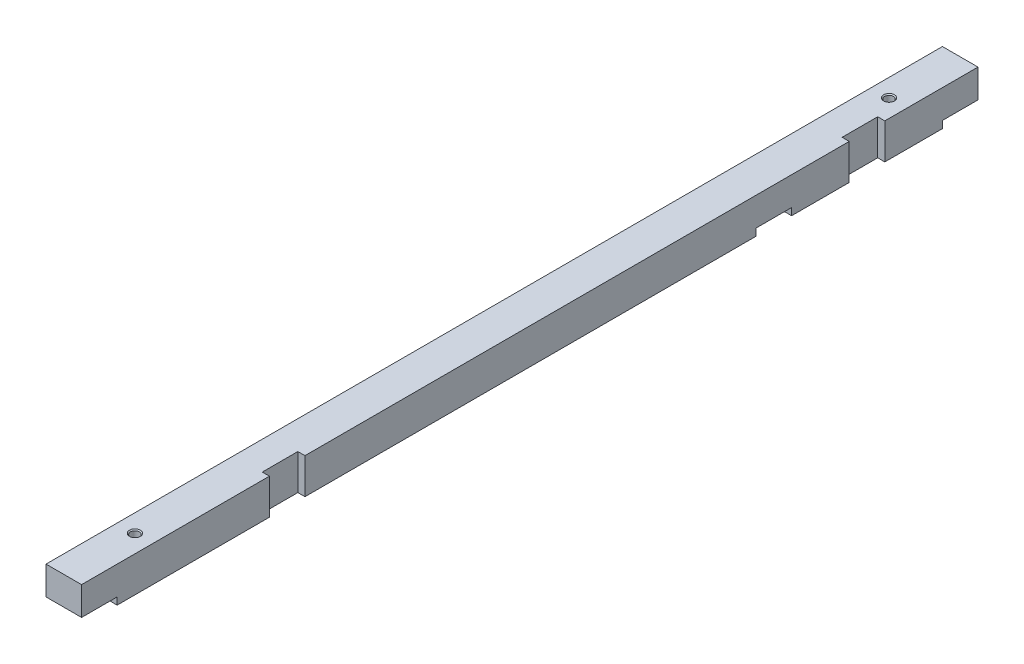
ISO-10303-21;
HEADER;
FILE_DESCRIPTION(('STEP AP214'),'2;1');
FILE_NAME('part.step','',(''),(''),'','','');
FILE_SCHEMA(('AUTOMOTIVE_DESIGN { 1 0 10303 214 1 1 1 1 }'));
ENDSEC;
DATA;
#1=APPLICATION_CONTEXT('core data for automotive mechanical design processes');
#2=APPLICATION_PROTOCOL_DEFINITION('international standard','automotive_design',2000,#1);
#3=PRODUCT_CONTEXT('',#1,'mechanical');
#4=PRODUCT('Part','Part','',(#3));
#5=PRODUCT_RELATED_PRODUCT_CATEGORY('part','',(#4));
#6=PRODUCT_DEFINITION_FORMATION('','',#4);
#7=PRODUCT_DEFINITION_CONTEXT('part definition',#1,'design');
#8=PRODUCT_DEFINITION('design','',#6,#7);
#9=PRODUCT_DEFINITION_SHAPE('','',#8);
#10=(LENGTH_UNIT() NAMED_UNIT(*) SI_UNIT(.MILLI.,.METRE.));
#11=(NAMED_UNIT(*) PLANE_ANGLE_UNIT() SI_UNIT($,.RADIAN.));
#12=(NAMED_UNIT(*) SI_UNIT($,.STERADIAN.) SOLID_ANGLE_UNIT());
#13=UNCERTAINTY_MEASURE_WITH_UNIT(LENGTH_MEASURE(1.E-05),#10,'distance_accuracy_value','');
#14=(GEOMETRIC_REPRESENTATION_CONTEXT(3) GLOBAL_UNCERTAINTY_ASSIGNED_CONTEXT((#13)) GLOBAL_UNIT_ASSIGNED_CONTEXT((#10,
#11,#12)) REPRESENTATION_CONTEXT('',''));
#15=CARTESIAN_POINT('',(0.,0.,0.));
#16=DIRECTION('',(0.,0.,1.));
#17=DIRECTION('',(1.,0.,0.));
#18=AXIS2_PLACEMENT_3D('',#15,#16,#17);
#19=CARTESIAN_POINT('',(5.,5.,252.));
#20=DIRECTION('',(-1.,0.,0.));
#21=DIRECTION('',(0.,-1.,0.));
#22=AXIS2_PLACEMENT_3D('',#19,#20,#21);
#23=PLANE('',#22);
#24=DIRECTION('',(0.,0.,-1.));
#25=VECTOR('',#24,1.);
#26=CARTESIAN_POINT('',(5.,5.,252.));
#27=LINE('',#26,#25);
#28=CARTESIAN_POINT('',(5.,5.,189.2));
#29=VERTEX_POINT('',#28);
#30=CARTESIAN_POINT('',(5.,5.,36.2));
#31=VERTEX_POINT('',#30);
#32=EDGE_CURVE('E316',#29,#31,#27,.T.);
#33=ORIENTED_EDGE('',*,*,#32,.F.);
#34=DIRECTION('',(0.,-1.,0.));
#35=VECTOR('',#34,1.);
#36=CARTESIAN_POINT('',(5.,5.,189.2));
#37=LINE('',#36,#35);
#38=CARTESIAN_POINT('',(5.,-5.00000000000002,189.2));
#39=VERTEX_POINT('',#38);
#40=EDGE_CURVE('E206',#29,#39,#37,.T.);
#41=ORIENTED_EDGE('',*,*,#40,.T.);
#42=DIRECTION('',(0.,0.,-1.));
#43=VECTOR('',#42,1.);
#44=CARTESIAN_POINT('',(5.,-5.,252.));
#45=LINE('',#44,#43);
#46=CARTESIAN_POINT('',(5.,-5.,62.4));
#47=VERTEX_POINT('',#46);
#48=EDGE_CURVE('E191',#39,#47,#45,.T.);
#49=ORIENTED_EDGE('',*,*,#48,.T.);
#50=DIRECTION('',(0.,1.,0.));
#51=VECTOR('',#50,1.);
#52=CARTESIAN_POINT('',(5.,-5.,62.4));
#53=LINE('',#52,#51);
#54=CARTESIAN_POINT('',(5.,-3.,62.4));
#55=VERTEX_POINT('',#54);
#56=EDGE_CURVE('E251',#47,#55,#53,.T.);
#57=ORIENTED_EDGE('',*,*,#56,.T.);
#58=DIRECTION('',(0.,0.,-1.));
#59=VECTOR('',#58,1.);
#60=CARTESIAN_POINT('',(5.,-3.,52.3999999999999));
#61=LINE('',#60,#59);
#62=CARTESIAN_POINT('',(5.,-3.,52.3999999999999));
#63=VERTEX_POINT('',#62);
#64=EDGE_CURVE('E255',#55,#63,#61,.T.);
#65=ORIENTED_EDGE('',*,*,#64,.T.);
#66=DIRECTION('',(0.,-1.,0.));
#67=VECTOR('',#66,1.);
#68=CARTESIAN_POINT('',(5.,-5.,52.3999999999999));
#69=LINE('',#68,#67);
#70=CARTESIAN_POINT('',(5.,-5.,52.3999999999999));
#71=VERTEX_POINT('',#70);
#72=EDGE_CURVE('E248',#63,#71,#69,.T.);
#73=ORIENTED_EDGE('',*,*,#72,.T.);
#74=CARTESIAN_POINT('',(5.,-5.,36.2));
#75=VERTEX_POINT('',#74);
#76=EDGE_CURVE('E321',#71,#75,#45,.T.);
#77=ORIENTED_EDGE('',*,*,#76,.T.);
#78=DIRECTION('',(0.,1.,0.));
#79=VECTOR('',#78,1.);
#80=CARTESIAN_POINT('',(5.,5.,36.2));
#81=LINE('',#80,#79);
#82=EDGE_CURVE('E222',#75,#31,#81,.T.);
#83=ORIENTED_EDGE('',*,*,#82,.T.);
#84=EDGE_LOOP('',(#33,#41,#49,#57,#65,#73,#77,#83));
#85=FACE_BOUND('',#84,.T.);
#86=ADVANCED_FACE('F36',(#85),#23,.F.);
#87=CARTESIAN_POINT('',(5.,5.,26.2));
#88=VERTEX_POINT('',#87);
#89=CARTESIAN_POINT('',(5.,5.,0.));
#90=VERTEX_POINT('',#89);
#91=EDGE_CURVE('E311',#88,#90,#27,.T.);
#92=ORIENTED_EDGE('',*,*,#91,.F.);
#93=DIRECTION('',(0.,-1.,0.));
#94=VECTOR('',#93,1.);
#95=CARTESIAN_POINT('',(5.,5.,26.2));
#96=LINE('',#95,#94);
#97=CARTESIAN_POINT('',(5.,-5.,26.2));
#98=VERTEX_POINT('',#97);
#99=EDGE_CURVE('E226',#88,#98,#96,.T.);
#100=ORIENTED_EDGE('',*,*,#99,.T.);
#101=CARTESIAN_POINT('',(5.,-5.,10.));
#102=VERTEX_POINT('',#101);
#103=EDGE_CURVE('E315',#98,#102,#45,.T.);
#104=ORIENTED_EDGE('',*,*,#103,.T.);
#105=DIRECTION('',(0.,1.,0.));
#106=VECTOR('',#105,1.);
#107=CARTESIAN_POINT('',(5.,-5.,10.));
#108=LINE('',#107,#106);
#109=CARTESIAN_POINT('',(5.,-3.,10.));
#110=VERTEX_POINT('',#109);
#111=EDGE_CURVE('E275',#102,#110,#108,.T.);
#112=ORIENTED_EDGE('',*,*,#111,.T.);
#113=DIRECTION('',(0.,0.,-1.));
#114=VECTOR('',#113,1.);
#115=CARTESIAN_POINT('',(5.,-3.,0.));
#116=LINE('',#115,#114);
#117=CARTESIAN_POINT('',(5.,-3.,0.));
#118=VERTEX_POINT('',#117);
#119=EDGE_CURVE('E278',#110,#118,#116,.T.);
#120=ORIENTED_EDGE('',*,*,#119,.T.);
#121=DIRECTION('',(0.,1.,0.));
#122=VECTOR('',#121,1.);
#123=CARTESIAN_POINT('',(5.,5.,0.));
#124=LINE('',#123,#122);
#125=EDGE_CURVE('E305',#118,#90,#124,.T.);
#126=ORIENTED_EDGE('',*,*,#125,.T.);
#127=EDGE_LOOP('',(#92,#100,#104,#112,#120,#126));
#128=FACE_BOUND('',#127,.T.);
#129=ADVANCED_FACE('F340',(#128),#23,.F.);
#130=CARTESIAN_POINT('',(-5.,-5.,252.));
#131=DIRECTION('',(0.,1.,0.));
#132=DIRECTION('',(0.,0.,1.));
#133=AXIS2_PLACEMENT_3D('',#130,#131,#132);
#134=PLANE('',#133);
#135=CARTESIAN_POINT('',(0.,-5.00000000000002,20.));
#136=DIRECTION('',(0.,1.,0.));
#137=DIRECTION('',(0.,0.,1.));
#138=AXIS2_PLACEMENT_3D('',#135,#136,#137);
#139=CIRCLE('',#138,1.25);
#140=CARTESIAN_POINT('',(0.,-5.00000000000002,21.25));
#141=VERTEX_POINT('',#140);
#142=EDGE_CURVE('E601',#141,#141,#139,.T.);
#143=ORIENTED_EDGE('',*,*,#142,.T.);
#144=EDGE_LOOP('',(#143));
#145=FACE_BOUND('',#144,.T.);
#146=ORIENTED_EDGE('',*,*,#103,.F.);
#147=DIRECTION('',(1.,0.,0.));
#148=VECTOR('',#147,1.);
#149=CARTESIAN_POINT('',(3.00000000000003,-5.,26.2));
#150=LINE('',#149,#148);
#151=CARTESIAN_POINT('',(3.00000000000003,-5.,26.2));
#152=VERTEX_POINT('',#151);
#153=EDGE_CURVE('E208',#152,#98,#150,.T.);
#154=ORIENTED_EDGE('',*,*,#153,.F.);
#155=DIRECTION('',(0.,0.,-1.));
#156=VECTOR('',#155,1.);
#157=CARTESIAN_POINT('',(3.00000000000003,-5.,36.2));
#158=LINE('',#157,#156);
#159=CARTESIAN_POINT('',(3.00000000000003,-5.,36.2));
#160=VERTEX_POINT('',#159);
#161=EDGE_CURVE('E212',#160,#152,#158,.T.);
#162=ORIENTED_EDGE('',*,*,#161,.F.);
#163=DIRECTION('',(-1.,0.,0.));
#164=VECTOR('',#163,1.);
#165=CARTESIAN_POINT('',(234.,-5.,36.2));
#166=LINE('',#165,#164);
#167=EDGE_CURVE('E216',#75,#160,#166,.T.);
#168=ORIENTED_EDGE('',*,*,#167,.F.);
#169=ORIENTED_EDGE('',*,*,#76,.F.);
#170=DIRECTION('',(-1.,0.,0.));
#171=VECTOR('',#170,1.);
#172=CARTESIAN_POINT('',(5.,-5.,52.3999999999999));
#173=LINE('',#172,#171);
#174=CARTESIAN_POINT('',(-5.,-5.00000000000001,52.3999999999999));
#175=VERTEX_POINT('',#174);
#176=EDGE_CURVE('E258',#71,#175,#173,.T.);
#177=ORIENTED_EDGE('',*,*,#176,.T.);
#178=DIRECTION('',(0.,0.,-1.));
#179=VECTOR('',#178,1.);
#180=CARTESIAN_POINT('',(-5.,-5.,252.));
#181=LINE('',#180,#179);
#182=CARTESIAN_POINT('',(-5.,-5.00000000000001,10.));
#183=VERTEX_POINT('',#182);
#184=EDGE_CURVE('E320',#175,#183,#181,.T.);
#185=ORIENTED_EDGE('',*,*,#184,.T.);
#186=DIRECTION('',(-1.,0.,0.));
#187=VECTOR('',#186,1.);
#188=CARTESIAN_POINT('',(5.,-5.,10.));
#189=LINE('',#188,#187);
#190=EDGE_CURVE('E282',#102,#183,#189,.T.);
#191=ORIENTED_EDGE('',*,*,#190,.F.);
#192=EDGE_LOOP('',(#146,#154,#162,#168,#169,#177,#185,#191));
#193=FACE_BOUND('',#192,.T.);
#194=ADVANCED_FACE('F347',(#145,#193),#134,.F.);
#195=CARTESIAN_POINT('',(-5.,5.,252.));
#196=DIRECTION('',(1.,0.,0.));
#197=DIRECTION('',(0.,1.,0.));
#198=AXIS2_PLACEMENT_3D('',#195,#196,#197);
#199=PLANE('',#198);
#200=CARTESIAN_POINT('',(-5.,-5.00000000000002,242.));
#201=VERTEX_POINT('',#200);
#202=CARTESIAN_POINT('',(-5.,-5.00000000000001,62.4));
#203=VERTEX_POINT('',#202);
#204=EDGE_CURVE('E322',#201,#203,#181,.T.);
#205=ORIENTED_EDGE('',*,*,#204,.F.);
#206=DIRECTION('',(0.,-1.,0.));
#207=VECTOR('',#206,1.);
#208=CARTESIAN_POINT('',(-5.,-5.00000000000002,242.));
#209=LINE('',#208,#207);
#210=CARTESIAN_POINT('',(-5.,-3.,242.));
#211=VERTEX_POINT('',#210);
#212=EDGE_CURVE('E229',#211,#201,#209,.T.);
#213=ORIENTED_EDGE('',*,*,#212,.F.);
#214=DIRECTION('',(0.,0.,-1.));
#215=VECTOR('',#214,1.);
#216=CARTESIAN_POINT('',(-5.,-3.,242.));
#217=LINE('',#216,#215);
#218=CARTESIAN_POINT('',(-5.,-3.,252.));
#219=VERTEX_POINT('',#218);
#220=EDGE_CURVE('E234',#219,#211,#217,.T.);
#221=ORIENTED_EDGE('',*,*,#220,.F.);
#222=DIRECTION('',(0.,-1.,0.));
#223=VECTOR('',#222,1.);
#224=CARTESIAN_POINT('',(-5.,5.,252.));
#225=LINE('',#224,#223);
#226=CARTESIAN_POINT('',(-5.,5.,252.));
#227=VERTEX_POINT('',#226);
#228=EDGE_CURVE('E294',#227,#219,#225,.T.);
#229=ORIENTED_EDGE('',*,*,#228,.F.);
#230=DIRECTION('',(0.,0.,-1.));
#231=VECTOR('',#230,1.);
#232=CARTESIAN_POINT('',(-5.,5.,252.));
#233=LINE('',#232,#231);
#234=CARTESIAN_POINT('',(-5.,5.,0.));
#235=VERTEX_POINT('',#234);
#236=EDGE_CURVE('E302',#227,#235,#233,.T.);
#237=ORIENTED_EDGE('',*,*,#236,.T.);
#238=DIRECTION('',(0.,-1.,0.));
#239=VECTOR('',#238,1.);
#240=CARTESIAN_POINT('',(-5.,5.,0.));
#241=LINE('',#240,#239);
#242=CARTESIAN_POINT('',(-5.,-3.,0.));
#243=VERTEX_POINT('',#242);
#244=EDGE_CURVE('E289',#235,#243,#241,.T.);
#245=ORIENTED_EDGE('',*,*,#244,.T.);
#246=DIRECTION('',(0.,0.,-1.));
#247=VECTOR('',#246,1.);
#248=CARTESIAN_POINT('',(-5.,-3.,0.));
#249=LINE('',#248,#247);
#250=CARTESIAN_POINT('',(-5.,-3.,10.));
#251=VERTEX_POINT('',#250);
#252=EDGE_CURVE('E279',#251,#243,#249,.T.);
#253=ORIENTED_EDGE('',*,*,#252,.F.);
#254=DIRECTION('',(0.,1.,0.));
#255=VECTOR('',#254,1.);
#256=CARTESIAN_POINT('',(-5.,-5.00000000000001,10.));
#257=LINE('',#256,#255);
#258=EDGE_CURVE('E267',#183,#251,#257,.T.);
#259=ORIENTED_EDGE('',*,*,#258,.F.);
#260=ORIENTED_EDGE('',*,*,#184,.F.);
#261=DIRECTION('',(0.,-1.,0.));
#262=VECTOR('',#261,1.);
#263=CARTESIAN_POINT('',(-5.,-5.00000000000001,52.3999999999999));
#264=LINE('',#263,#262);
#265=CARTESIAN_POINT('',(-5.,-3.,52.3999999999999));
#266=VERTEX_POINT('',#265);
#267=EDGE_CURVE('E243',#266,#175,#264,.T.);
#268=ORIENTED_EDGE('',*,*,#267,.F.);
#269=DIRECTION('',(0.,0.,-1.));
#270=VECTOR('',#269,1.);
#271=CARTESIAN_POINT('',(-5.,-3.,52.3999999999999));
#272=LINE('',#271,#270);
#273=CARTESIAN_POINT('',(-5.,-3.,62.4));
#274=VERTEX_POINT('',#273);
#275=EDGE_CURVE('E252',#274,#266,#272,.T.);
#276=ORIENTED_EDGE('',*,*,#275,.F.);
#277=DIRECTION('',(0.,1.,0.));
#278=VECTOR('',#277,1.);
#279=CARTESIAN_POINT('',(-5.,-5.00000000000001,62.4));
#280=LINE('',#279,#278);
#281=EDGE_CURVE('E260',#203,#274,#280,.T.);
#282=ORIENTED_EDGE('',*,*,#281,.F.);
#283=EDGE_LOOP('',(#205,#213,#221,#229,#237,#245,#253,#259,#260,#268,#276,#282));
#284=FACE_BOUND('',#283,.T.);
#285=ADVANCED_FACE('F38',(#284),#199,.F.);
#286=CARTESIAN_POINT('',(0.,-5.00000000000002,232.));
#287=DIRECTION('',(0.,1.,0.));
#288=DIRECTION('',(0.,0.,1.));
#289=AXIS2_PLACEMENT_3D('',#286,#287,#288);
#290=CIRCLE('',#289,1.25);
#291=CARTESIAN_POINT('',(0.,-5.00000000000002,233.25));
#292=VERTEX_POINT('',#291);
#293=EDGE_CURVE('E197',#292,#292,#290,.T.);
#294=ORIENTED_EDGE('',*,*,#293,.T.);
#295=EDGE_LOOP('',(#294));
#296=FACE_BOUND('',#295,.T.);
#297=ORIENTED_EDGE('',*,*,#48,.F.);
#298=DIRECTION('',(-1.,0.,0.));
#299=VECTOR('',#298,1.);
#300=CARTESIAN_POINT('',(234.,-5.00000000000002,189.2));
#301=LINE('',#300,#299);
#302=CARTESIAN_POINT('',(3.00000000000003,-5.00000000000002,189.2));
#303=VERTEX_POINT('',#302);
#304=EDGE_CURVE('E175',#39,#303,#301,.T.);
#305=ORIENTED_EDGE('',*,*,#304,.T.);
#306=DIRECTION('',(0.,0.,1.));
#307=VECTOR('',#306,1.);
#308=CARTESIAN_POINT('',(3.00000000000003,-5.00000000000002,189.2));
#309=LINE('',#308,#307);
#310=CARTESIAN_POINT('',(3.00000000000003,-5.00000000000002,199.2));
#311=VERTEX_POINT('',#310);
#312=EDGE_CURVE('E182',#303,#311,#309,.T.);
#313=ORIENTED_EDGE('',*,*,#312,.T.);
#314=DIRECTION('',(1.,0.,0.));
#315=VECTOR('',#314,1.);
#316=CARTESIAN_POINT('',(3.00000000000003,-5.00000000000002,199.2));
#317=LINE('',#316,#315);
#318=CARTESIAN_POINT('',(5.,-5.00000000000002,199.2));
#319=VERTEX_POINT('',#318);
#320=EDGE_CURVE('E179',#311,#319,#317,.T.);
#321=ORIENTED_EDGE('',*,*,#320,.T.);
#322=CARTESIAN_POINT('',(5.,-5.00000000000002,242.));
#323=VERTEX_POINT('',#322);
#324=EDGE_CURVE('E317',#323,#319,#45,.T.);
#325=ORIENTED_EDGE('',*,*,#324,.F.);
#326=DIRECTION('',(-1.,0.,0.));
#327=VECTOR('',#326,1.);
#328=CARTESIAN_POINT('',(5.,-5.00000000000002,242.));
#329=LINE('',#328,#327);
#330=EDGE_CURVE('E237',#323,#201,#329,.T.);
#331=ORIENTED_EDGE('',*,*,#330,.T.);
#332=ORIENTED_EDGE('',*,*,#204,.T.);
#333=DIRECTION('',(-1.,0.,0.));
#334=VECTOR('',#333,1.);
#335=CARTESIAN_POINT('',(5.,-5.,62.4));
#336=LINE('',#335,#334);
#337=EDGE_CURVE('E270',#47,#203,#336,.T.);
#338=ORIENTED_EDGE('',*,*,#337,.F.);
#339=EDGE_LOOP('',(#297,#305,#313,#321,#325,#331,#332,#338));
#340=FACE_BOUND('',#339,.T.);
#341=ADVANCED_FACE('F189',(#296,#340),#134,.F.);
#342=ORIENTED_EDGE('',*,*,#324,.T.);
#343=DIRECTION('',(0.,1.,0.));
#344=VECTOR('',#343,1.);
#345=CARTESIAN_POINT('',(5.,5.,199.2));
#346=LINE('',#345,#344);
#347=CARTESIAN_POINT('',(5.,5.,199.2));
#348=VERTEX_POINT('',#347);
#349=EDGE_CURVE('E202',#319,#348,#346,.T.);
#350=ORIENTED_EDGE('',*,*,#349,.T.);
#351=CARTESIAN_POINT('',(5.,5.,252.));
#352=VERTEX_POINT('',#351);
#353=EDGE_CURVE('E312',#352,#348,#27,.T.);
#354=ORIENTED_EDGE('',*,*,#353,.F.);
#355=DIRECTION('',(0.,1.,0.));
#356=VECTOR('',#355,1.);
#357=CARTESIAN_POINT('',(5.,5.,252.));
#358=LINE('',#357,#356);
#359=CARTESIAN_POINT('',(5.,-3.,252.));
#360=VERTEX_POINT('',#359);
#361=EDGE_CURVE('E297',#360,#352,#358,.T.);
#362=ORIENTED_EDGE('',*,*,#361,.F.);
#363=DIRECTION('',(0.,0.,-1.));
#364=VECTOR('',#363,1.);
#365=CARTESIAN_POINT('',(5.,-3.,242.));
#366=LINE('',#365,#364);
#367=CARTESIAN_POINT('',(5.,-3.,242.));
#368=VERTEX_POINT('',#367);
#369=EDGE_CURVE('E233',#360,#368,#366,.T.);
#370=ORIENTED_EDGE('',*,*,#369,.T.);
#371=DIRECTION('',(0.,-1.,0.));
#372=VECTOR('',#371,1.);
#373=CARTESIAN_POINT('',(5.,-5.00000000000002,242.));
#374=LINE('',#373,#372);
#375=EDGE_CURVE('E230',#368,#323,#374,.T.);
#376=ORIENTED_EDGE('',*,*,#375,.T.);
#377=EDGE_LOOP('',(#342,#350,#354,#362,#370,#376));
#378=FACE_BOUND('',#377,.T.);
#379=ADVANCED_FACE('F378',(#378),#23,.F.);
#380=CARTESIAN_POINT('',(-5.,5.,252.));
#381=DIRECTION('',(0.,-1.,0.));
#382=DIRECTION('',(0.,0.,-1.));
#383=AXIS2_PLACEMENT_3D('',#380,#381,#382);
#384=PLANE('',#383);
#385=CARTESIAN_POINT('',(0.,5.,20.));
#386=DIRECTION('',(0.,1.,0.));
#387=DIRECTION('',(0.,0.,1.));
#388=AXIS2_PLACEMENT_3D('',#385,#386,#387);
#389=CIRCLE('',#388,1.525);
#390=CARTESIAN_POINT('',(0.,5.,21.525));
#391=VERTEX_POINT('',#390);
#392=EDGE_CURVE('E599',#391,#391,#389,.T.);
#393=ORIENTED_EDGE('',*,*,#392,.F.);
#394=EDGE_LOOP('',(#393));
#395=FACE_BOUND('',#394,.T.);
#396=CARTESIAN_POINT('',(0.,5.,232.));
#397=DIRECTION('',(0.,1.,0.));
#398=DIRECTION('',(0.,0.,1.));
#399=AXIS2_PLACEMENT_3D('',#396,#397,#398);
#400=CIRCLE('',#399,1.525);
#401=CARTESIAN_POINT('',(0.,5.,233.525));
#402=VERTEX_POINT('',#401);
#403=EDGE_CURVE('E606',#402,#402,#400,.T.);
#404=ORIENTED_EDGE('',*,*,#403,.F.);
#405=EDGE_LOOP('',(#404));
#406=FACE_BOUND('',#405,.T.);
#407=DIRECTION('',(0.,0.,1.));
#408=VECTOR('',#407,1.);
#409=CARTESIAN_POINT('',(3.00000000000003,5.,189.2));
#410=LINE('',#409,#408);
#411=CARTESIAN_POINT('',(3.00000000000003,5.,189.2));
#412=VERTEX_POINT('',#411);
#413=CARTESIAN_POINT('',(3.00000000000003,5.,199.2));
#414=VERTEX_POINT('',#413);
#415=EDGE_CURVE('E194',#412,#414,#410,.T.);
#416=ORIENTED_EDGE('',*,*,#415,.F.);
#417=DIRECTION('',(1.,0.,0.));
#418=VECTOR('',#417,1.);
#419=CARTESIAN_POINT('',(-5.,5.,189.2));
#420=LINE('',#419,#418);
#421=EDGE_CURVE('E11',#412,#29,#420,.T.);
#422=ORIENTED_EDGE('',*,*,#421,.T.);
#423=ORIENTED_EDGE('',*,*,#32,.T.);
#424=DIRECTION('',(-1.,0.,0.));
#425=VECTOR('',#424,1.);
#426=CARTESIAN_POINT('',(-5.,5.,36.2));
#427=LINE('',#426,#425);
#428=CARTESIAN_POINT('',(3.00000000000003,5.,36.2));
#429=VERTEX_POINT('',#428);
#430=EDGE_CURVE('E44',#31,#429,#427,.T.);
#431=ORIENTED_EDGE('',*,*,#430,.T.);
#432=DIRECTION('',(0.,0.,-1.));
#433=VECTOR('',#432,1.);
#434=CARTESIAN_POINT('',(3.00000000000003,5.,36.2));
#435=LINE('',#434,#433);
#436=CARTESIAN_POINT('',(3.00000000000003,5.,26.2));
#437=VERTEX_POINT('',#436);
#438=EDGE_CURVE('E59',#429,#437,#435,.T.);
#439=ORIENTED_EDGE('',*,*,#438,.T.);
#440=DIRECTION('',(1.,0.,0.));
#441=VECTOR('',#440,1.);
#442=CARTESIAN_POINT('',(3.00000000000003,5.,26.2));
#443=LINE('',#442,#441);
#444=EDGE_CURVE('E209',#437,#88,#443,.T.);
#445=ORIENTED_EDGE('',*,*,#444,.T.);
#446=ORIENTED_EDGE('',*,*,#91,.T.);
#447=DIRECTION('',(-1.,0.,0.));
#448=VECTOR('',#447,1.);
#449=CARTESIAN_POINT('',(-5.,5.,0.));
#450=LINE('',#449,#448);
#451=EDGE_CURVE('E298',#90,#235,#450,.T.);
#452=ORIENTED_EDGE('',*,*,#451,.T.);
#453=ORIENTED_EDGE('',*,*,#236,.F.);
#454=DIRECTION('',(-1.,0.,0.));
#455=VECTOR('',#454,1.);
#456=CARTESIAN_POINT('',(-5.,5.,252.));
#457=LINE('',#456,#455);
#458=EDGE_CURVE('E300',#352,#227,#457,.T.);
#459=ORIENTED_EDGE('',*,*,#458,.F.);
#460=ORIENTED_EDGE('',*,*,#353,.T.);
#461=DIRECTION('',(1.,0.,0.));
#462=VECTOR('',#461,1.);
#463=CARTESIAN_POINT('',(3.00000000000003,5.,199.2));
#464=LINE('',#463,#462);
#465=EDGE_CURVE('E192',#414,#348,#464,.T.);
#466=ORIENTED_EDGE('',*,*,#465,.F.);
#467=EDGE_LOOP('',(#416,#422,#423,#431,#439,#445,#446,#452,#453,#459,#460,#466));
#468=FACE_BOUND('',#467,.T.);
#469=ADVANCED_FACE('F326',(#395,#406,#468),#384,.F.);
#470=CARTESIAN_POINT('',(0.,0.,252.));
#471=DIRECTION('',(0.,0.,1.));
#472=DIRECTION('',(1.,0.,0.));
#473=AXIS2_PLACEMENT_3D('',#470,#471,#472);
#474=PLANE('',#473);
#475=DIRECTION('',(-1.,0.,0.));
#476=VECTOR('',#475,1.);
#477=CARTESIAN_POINT('',(5.,-3.,252.));
#478=LINE('',#477,#476);
#479=EDGE_CURVE('E244',#360,#219,#478,.T.);
#480=ORIENTED_EDGE('',*,*,#479,.F.);
#481=ORIENTED_EDGE('',*,*,#361,.T.);
#482=ORIENTED_EDGE('',*,*,#458,.T.);
#483=ORIENTED_EDGE('',*,*,#228,.T.);
#484=EDGE_LOOP('',(#480,#481,#482,#483));
#485=FACE_BOUND('',#484,.T.);
#486=ADVANCED_FACE('F389',(#485),#474,.T.);
#487=CARTESIAN_POINT('',(0.,0.,0.));
#488=DIRECTION('',(0.,0.,1.));
#489=DIRECTION('',(1.,0.,0.));
#490=AXIS2_PLACEMENT_3D('',#487,#488,#489);
#491=PLANE('',#490);
#492=ORIENTED_EDGE('',*,*,#125,.F.);
#493=DIRECTION('',(-1.,0.,0.));
#494=VECTOR('',#493,1.);
#495=CARTESIAN_POINT('',(5.,-3.,0.));
#496=LINE('',#495,#494);
#497=EDGE_CURVE('E286',#118,#243,#496,.T.);
#498=ORIENTED_EDGE('',*,*,#497,.T.);
#499=ORIENTED_EDGE('',*,*,#244,.F.);
#500=ORIENTED_EDGE('',*,*,#451,.F.);
#501=EDGE_LOOP('',(#492,#498,#499,#500));
#502=FACE_BOUND('',#501,.T.);
#503=ADVANCED_FACE('F359',(#502),#491,.F.);
#504=CARTESIAN_POINT('',(5.,-3.,0.));
#505=DIRECTION('',(0.,1.,0.));
#506=DIRECTION('',(-1.,0.,0.));
#507=AXIS2_PLACEMENT_3D('',#504,#505,#506);
#508=PLANE('',#507);
#509=ORIENTED_EDGE('',*,*,#252,.T.);
#510=ORIENTED_EDGE('',*,*,#497,.F.);
#511=ORIENTED_EDGE('',*,*,#119,.F.);
#512=DIRECTION('',(-1.,0.,0.));
#513=VECTOR('',#512,1.);
#514=CARTESIAN_POINT('',(5.,-3.,10.));
#515=LINE('',#514,#513);
#516=EDGE_CURVE('E290',#110,#251,#515,.T.);
#517=ORIENTED_EDGE('',*,*,#516,.T.);
#518=EDGE_LOOP('',(#509,#510,#511,#517));
#519=FACE_BOUND('',#518,.T.);
#520=ADVANCED_FACE('F356',(#519),#508,.F.);
#521=CARTESIAN_POINT('',(5.,-5.,10.));
#522=DIRECTION('',(0.,0.,1.));
#523=DIRECTION('',(1.,0.,0.));
#524=AXIS2_PLACEMENT_3D('',#521,#522,#523);
#525=PLANE('',#524);
#526=ORIENTED_EDGE('',*,*,#258,.T.);
#527=ORIENTED_EDGE('',*,*,#516,.F.);
#528=ORIENTED_EDGE('',*,*,#111,.F.);
#529=ORIENTED_EDGE('',*,*,#190,.T.);
#530=EDGE_LOOP('',(#526,#527,#528,#529));
#531=FACE_BOUND('',#530,.T.);
#532=ADVANCED_FACE('F344',(#531),#525,.F.);
#533=CARTESIAN_POINT('',(5.,-5.,52.3999999999999));
#534=DIRECTION('',(0.,0.,-1.));
#535=DIRECTION('',(-1.,0.,0.));
#536=AXIS2_PLACEMENT_3D('',#533,#534,#535);
#537=PLANE('',#536);
#538=ORIENTED_EDGE('',*,*,#267,.T.);
#539=ORIENTED_EDGE('',*,*,#176,.F.);
#540=ORIENTED_EDGE('',*,*,#72,.F.);
#541=DIRECTION('',(-1.,0.,0.));
#542=VECTOR('',#541,1.);
#543=CARTESIAN_POINT('',(5.,-3.,52.3999999999999));
#544=LINE('',#543,#542);
#545=EDGE_CURVE('E265',#63,#266,#544,.T.);
#546=ORIENTED_EDGE('',*,*,#545,.T.);
#547=EDGE_LOOP('',(#538,#539,#540,#546));
#548=FACE_BOUND('',#547,.T.);
#549=ADVANCED_FACE('F423',(#548),#537,.F.);
#550=CARTESIAN_POINT('',(5.,-3.,52.3999999999999));
#551=DIRECTION('',(0.,1.,0.));
#552=DIRECTION('',(-1.,0.,0.));
#553=AXIS2_PLACEMENT_3D('',#550,#551,#552);
#554=PLANE('',#553);
#555=ORIENTED_EDGE('',*,*,#275,.T.);
#556=ORIENTED_EDGE('',*,*,#545,.F.);
#557=ORIENTED_EDGE('',*,*,#64,.F.);
#558=DIRECTION('',(-1.,0.,0.));
#559=VECTOR('',#558,1.);
#560=CARTESIAN_POINT('',(5.,-3.,62.4));
#561=LINE('',#560,#559);
#562=EDGE_CURVE('E268',#55,#274,#561,.T.);
#563=ORIENTED_EDGE('',*,*,#562,.T.);
#564=EDGE_LOOP('',(#555,#556,#557,#563));
#565=FACE_BOUND('',#564,.T.);
#566=ADVANCED_FACE('F417',(#565),#554,.F.);
#567=CARTESIAN_POINT('',(5.,-5.,62.4));
#568=DIRECTION('',(0.,0.,1.));
#569=DIRECTION('',(1.,0.,0.));
#570=AXIS2_PLACEMENT_3D('',#567,#568,#569);
#571=PLANE('',#570);
#572=ORIENTED_EDGE('',*,*,#281,.T.);
#573=ORIENTED_EDGE('',*,*,#562,.F.);
#574=ORIENTED_EDGE('',*,*,#56,.F.);
#575=ORIENTED_EDGE('',*,*,#337,.T.);
#576=EDGE_LOOP('',(#572,#573,#574,#575));
#577=FACE_BOUND('',#576,.T.);
#578=ADVANCED_FACE('F410',(#577),#571,.F.);
#579=CARTESIAN_POINT('',(5.,-5.00000000000002,242.));
#580=DIRECTION('',(0.,0.,-1.));
#581=DIRECTION('',(-1.,0.,0.));
#582=AXIS2_PLACEMENT_3D('',#579,#580,#581);
#583=PLANE('',#582);
#584=ORIENTED_EDGE('',*,*,#212,.T.);
#585=ORIENTED_EDGE('',*,*,#330,.F.);
#586=ORIENTED_EDGE('',*,*,#375,.F.);
#587=DIRECTION('',(-1.,0.,0.));
#588=VECTOR('',#587,1.);
#589=CARTESIAN_POINT('',(5.,-3.,242.));
#590=LINE('',#589,#588);
#591=EDGE_CURVE('E241',#368,#211,#590,.T.);
#592=ORIENTED_EDGE('',*,*,#591,.T.);
#593=EDGE_LOOP('',(#584,#585,#586,#592));
#594=FACE_BOUND('',#593,.T.);
#595=ADVANCED_FACE('F408',(#594),#583,.F.);
#596=CARTESIAN_POINT('',(5.,-3.,242.));
#597=DIRECTION('',(0.,1.,0.));
#598=DIRECTION('',(-1.,0.,0.));
#599=AXIS2_PLACEMENT_3D('',#596,#597,#598);
#600=PLANE('',#599);
#601=ORIENTED_EDGE('',*,*,#220,.T.);
#602=ORIENTED_EDGE('',*,*,#591,.F.);
#603=ORIENTED_EDGE('',*,*,#369,.F.);
#604=ORIENTED_EDGE('',*,*,#479,.T.);
#605=EDGE_LOOP('',(#601,#602,#603,#604));
#606=FACE_BOUND('',#605,.T.);
#607=ADVANCED_FACE('F404',(#606),#600,.F.);
#608=CARTESIAN_POINT('',(3.00000000000003,5.,26.2));
#609=DIRECTION('',(0.,0.,-1.));
#610=DIRECTION('',(-1.,0.,0.));
#611=AXIS2_PLACEMENT_3D('',#608,#609,#610);
#612=PLANE('',#611);
#613=ORIENTED_EDGE('',*,*,#444,.F.);
#614=DIRECTION('',(0.,-1.,0.));
#615=VECTOR('',#614,1.);
#616=CARTESIAN_POINT('',(3.00000000000003,5.,26.2));
#617=LINE('',#616,#615);
#618=EDGE_CURVE('E220',#437,#152,#617,.T.);
#619=ORIENTED_EDGE('',*,*,#618,.T.);
#620=ORIENTED_EDGE('',*,*,#153,.T.);
#621=ORIENTED_EDGE('',*,*,#99,.F.);
#622=EDGE_LOOP('',(#613,#619,#620,#621));
#623=FACE_BOUND('',#622,.T.);
#624=ADVANCED_FACE('F364',(#623),#612,.F.);
#625=CARTESIAN_POINT('',(234.,5.,36.2));
#626=DIRECTION('',(0.,0.,1.));
#627=DIRECTION('',(1.,0.,0.));
#628=AXIS2_PLACEMENT_3D('',#625,#626,#627);
#629=PLANE('',#628);
#630=ORIENTED_EDGE('',*,*,#167,.T.);
#631=DIRECTION('',(0.,-1.,0.));
#632=VECTOR('',#631,1.);
#633=CARTESIAN_POINT('',(3.00000000000003,5.,36.2));
#634=LINE('',#633,#632);
#635=EDGE_CURVE('E214',#429,#160,#634,.T.);
#636=ORIENTED_EDGE('',*,*,#635,.F.);
#637=ORIENTED_EDGE('',*,*,#430,.F.);
#638=ORIENTED_EDGE('',*,*,#82,.F.);
#639=EDGE_LOOP('',(#630,#636,#637,#638));
#640=FACE_BOUND('',#639,.T.);
#641=ADVANCED_FACE('F329',(#640),#629,.F.);
#642=CARTESIAN_POINT('',(3.00000000000003,5.,36.2));
#643=DIRECTION('',(-1.,0.,0.));
#644=DIRECTION('',(0.,0.,1.));
#645=AXIS2_PLACEMENT_3D('',#642,#643,#644);
#646=PLANE('',#645);
#647=ORIENTED_EDGE('',*,*,#161,.T.);
#648=ORIENTED_EDGE('',*,*,#618,.F.);
#649=ORIENTED_EDGE('',*,*,#438,.F.);
#650=ORIENTED_EDGE('',*,*,#635,.T.);
#651=EDGE_LOOP('',(#647,#648,#649,#650));
#652=FACE_BOUND('',#651,.T.);
#653=ADVANCED_FACE('F366',(#652),#646,.F.);
#654=CARTESIAN_POINT('',(234.,-5.00000000000002,189.2));
#655=DIRECTION('',(0.,0.,-1.));
#656=DIRECTION('',(-1.,0.,0.));
#657=AXIS2_PLACEMENT_3D('',#654,#655,#656);
#658=PLANE('',#657);
#659=ORIENTED_EDGE('',*,*,#421,.F.);
#660=DIRECTION('',(0.,1.,0.));
#661=VECTOR('',#660,1.);
#662=CARTESIAN_POINT('',(3.00000000000003,-5.00000000000002,189.2));
#663=LINE('',#662,#661);
#664=EDGE_CURVE('E51',#303,#412,#663,.T.);
#665=ORIENTED_EDGE('',*,*,#664,.F.);
#666=ORIENTED_EDGE('',*,*,#304,.F.);
#667=ORIENTED_EDGE('',*,*,#40,.F.);
#668=EDGE_LOOP('',(#659,#665,#666,#667));
#669=FACE_BOUND('',#668,.T.);
#670=ADVANCED_FACE('F173',(#669),#658,.F.);
#671=CARTESIAN_POINT('',(3.00000000000003,-5.00000000000002,199.2));
#672=DIRECTION('',(0.,0.,1.));
#673=DIRECTION('',(1.,0.,0.));
#674=AXIS2_PLACEMENT_3D('',#671,#672,#673);
#675=PLANE('',#674);
#676=ORIENTED_EDGE('',*,*,#320,.F.);
#677=DIRECTION('',(0.,1.,0.));
#678=VECTOR('',#677,1.);
#679=CARTESIAN_POINT('',(3.00000000000003,-5.00000000000002,199.2));
#680=LINE('',#679,#678);
#681=EDGE_CURVE('E178',#311,#414,#680,.T.);
#682=ORIENTED_EDGE('',*,*,#681,.T.);
#683=ORIENTED_EDGE('',*,*,#465,.T.);
#684=ORIENTED_EDGE('',*,*,#349,.F.);
#685=EDGE_LOOP('',(#676,#682,#683,#684));
#686=FACE_BOUND('',#685,.T.);
#687=ADVANCED_FACE('F373',(#686),#675,.F.);
#688=CARTESIAN_POINT('',(3.00000000000003,-5.00000000000002,189.2));
#689=DIRECTION('',(-1.,0.,0.));
#690=DIRECTION('',(0.,0.,1.));
#691=AXIS2_PLACEMENT_3D('',#688,#689,#690);
#692=PLANE('',#691);
#693=ORIENTED_EDGE('',*,*,#415,.T.);
#694=ORIENTED_EDGE('',*,*,#681,.F.);
#695=ORIENTED_EDGE('',*,*,#312,.F.);
#696=ORIENTED_EDGE('',*,*,#664,.T.);
#697=EDGE_LOOP('',(#693,#694,#695,#696));
#698=FACE_BOUND('',#697,.T.);
#699=ADVANCED_FACE('F183',(#698),#692,.F.);
#700=CARTESIAN_POINT('',(0.,5.,232.));
#701=DIRECTION('',(0.,1.,0.));
#702=DIRECTION('',(0.,0.,1.));
#703=AXIS2_PLACEMENT_3D('',#700,#701,#702);
#704=CYLINDRICAL_SURFACE('',#703,1.24999999999999);
#705=ORIENTED_EDGE('',*,*,#293,.F.);
#706=EDGE_LOOP('',(#705));
#707=FACE_BOUND('',#706,.T.);
#708=CARTESIAN_POINT('',(0.,4.72499999999999,232.));
#709=DIRECTION('',(0.,1.,0.));
#710=DIRECTION('',(0.,0.,1.));
#711=AXIS2_PLACEMENT_3D('',#708,#709,#710);
#712=CIRCLE('',#711,1.24999999999999);
#713=CARTESIAN_POINT('',(0.,4.72499999999999,233.25));
#714=VERTEX_POINT('',#713);
#715=EDGE_CURVE('E608',#714,#714,#712,.T.);
#716=ORIENTED_EDGE('',*,*,#715,.T.);
#717=EDGE_LOOP('',(#716));
#718=FACE_BOUND('',#717,.T.);
#719=ADVANCED_FACE('F527',(#707,#718),#704,.F.);
#720=CARTESIAN_POINT('',(0.,5.,232.));
#721=DIRECTION('',(0.,1.,0.));
#722=DIRECTION('',(0.,0.,1.));
#723=AXIS2_PLACEMENT_3D('',#720,#721,#722);
#724=CONICAL_SURFACE('',#723,1.525,0.785398163397448);
#725=ORIENTED_EDGE('',*,*,#715,.F.);
#726=EDGE_LOOP('',(#725));
#727=FACE_BOUND('',#726,.T.);
#728=ORIENTED_EDGE('',*,*,#403,.T.);
#729=EDGE_LOOP('',(#728));
#730=FACE_BOUND('',#729,.T.);
#731=ADVANCED_FACE('F557',(#727,#730),#724,.F.);
#732=CARTESIAN_POINT('',(0.,5.,20.));
#733=DIRECTION('',(0.,1.,0.));
#734=DIRECTION('',(0.,0.,1.));
#735=AXIS2_PLACEMENT_3D('',#732,#733,#734);
#736=CYLINDRICAL_SURFACE('',#735,1.24999999999999);
#737=ORIENTED_EDGE('',*,*,#142,.F.);
#738=EDGE_LOOP('',(#737));
#739=FACE_BOUND('',#738,.T.);
#740=CARTESIAN_POINT('',(0.,4.72499999999999,20.));
#741=DIRECTION('',(0.,1.,0.));
#742=DIRECTION('',(0.,0.,1.));
#743=AXIS2_PLACEMENT_3D('',#740,#741,#742);
#744=CIRCLE('',#743,1.24999999999999);
#745=CARTESIAN_POINT('',(0.,4.72499999999999,21.25));
#746=VERTEX_POINT('',#745);
#747=EDGE_CURVE('E596',#746,#746,#744,.T.);
#748=ORIENTED_EDGE('',*,*,#747,.T.);
#749=EDGE_LOOP('',(#748));
#750=FACE_BOUND('',#749,.T.);
#751=ADVANCED_FACE('F568',(#739,#750),#736,.F.);
#752=CARTESIAN_POINT('',(0.,5.,20.));
#753=DIRECTION('',(0.,1.,0.));
#754=DIRECTION('',(0.,0.,1.));
#755=AXIS2_PLACEMENT_3D('',#752,#753,#754);
#756=CONICAL_SURFACE('',#755,1.525,0.785398163397448);
#757=ORIENTED_EDGE('',*,*,#747,.F.);
#758=EDGE_LOOP('',(#757));
#759=FACE_BOUND('',#758,.T.);
#760=ORIENTED_EDGE('',*,*,#392,.T.);
#761=EDGE_LOOP('',(#760));
#762=FACE_BOUND('',#761,.T.);
#763=ADVANCED_FACE('F578',(#759,#762),#756,.F.);
#764=CLOSED_SHELL('',(#86,#129,#194,#285,#341,#379,#469,#486,#503,#520,#532,#549,#566,#578,#595,
#607,#624,#641,#653,#670,#687,#699,#719,#731,#751,#763));
#765=MANIFOLD_SOLID_BREP('B2',#764);
#766=ADVANCED_BREP_SHAPE_REPRESENTATION('',(#18,#765),#14);
#767=SHAPE_DEFINITION_REPRESENTATION(#9,#766);
ENDSEC;
END-ISO-10303-21;
